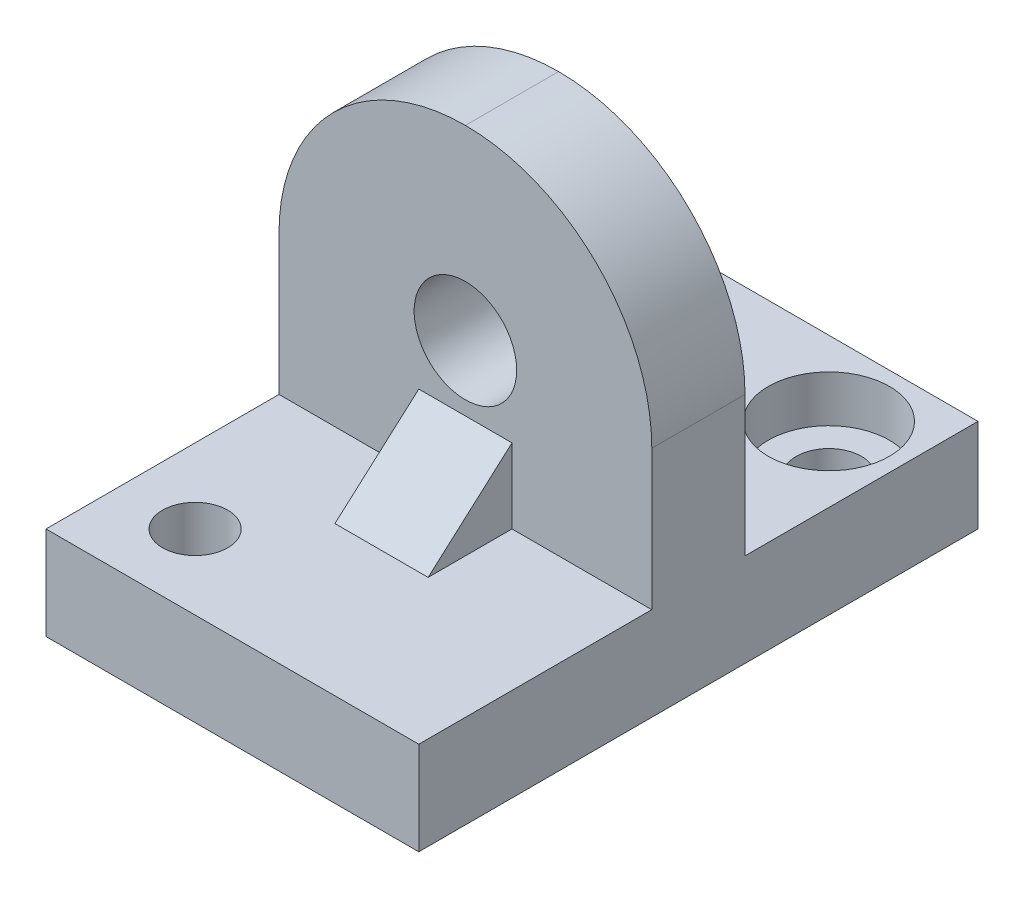
ISO-10303-21;
HEADER;
FILE_DESCRIPTION(('STEP AP214'),'2;1');
FILE_NAME('part.step','',(''),(''),'','','');
FILE_SCHEMA(('AUTOMOTIVE_DESIGN { 1 0 10303 214 1 1 1 1 }'));
ENDSEC;
DATA;
#1=APPLICATION_CONTEXT('core data for automotive mechanical design processes');
#2=APPLICATION_PROTOCOL_DEFINITION('international standard','automotive_design',2000,#1);
#3=PRODUCT_CONTEXT('',#1,'mechanical');
#4=PRODUCT('Part','Part','',(#3));
#5=PRODUCT_RELATED_PRODUCT_CATEGORY('part','',(#4));
#6=PRODUCT_DEFINITION_FORMATION('','',#4);
#7=PRODUCT_DEFINITION_CONTEXT('part definition',#1,'design');
#8=PRODUCT_DEFINITION('design','',#6,#7);
#9=PRODUCT_DEFINITION_SHAPE('','',#8);
#10=(LENGTH_UNIT() NAMED_UNIT(*) SI_UNIT(.MILLI.,.METRE.));
#11=(NAMED_UNIT(*) PLANE_ANGLE_UNIT() SI_UNIT($,.RADIAN.));
#12=(NAMED_UNIT(*) SI_UNIT($,.STERADIAN.) SOLID_ANGLE_UNIT());
#13=UNCERTAINTY_MEASURE_WITH_UNIT(LENGTH_MEASURE(1.E-05),#10,'distance_accuracy_value','');
#14=(GEOMETRIC_REPRESENTATION_CONTEXT(3) GLOBAL_UNCERTAINTY_ASSIGNED_CONTEXT((#13)) GLOBAL_UNIT_ASSIGNED_CONTEXT((#10,
#11,#12)) REPRESENTATION_CONTEXT('',''));
#15=CARTESIAN_POINT('',(0.,0.,0.));
#16=DIRECTION('',(0.,0.,1.));
#17=DIRECTION('',(1.,0.,0.));
#18=AXIS2_PLACEMENT_3D('',#15,#16,#17);
#19=CARTESIAN_POINT('',(12.,-27.5,-22.));
#20=DIRECTION('',(0.,1.,0.));
#21=DIRECTION('',(0.,0.,1.));
#22=AXIS2_PLACEMENT_3D('',#19,#20,#21);
#23=CYLINDRICAL_SURFACE('',#22,3.5);
#24=CARTESIAN_POINT('',(12.,-27.5,-22.));
#25=DIRECTION('',(0.,1.,0.));
#26=DIRECTION('',(0.,0.,1.));
#27=AXIS2_PLACEMENT_3D('',#24,#25,#26);
#28=CIRCLE('',#27,3.5);
#29=CARTESIAN_POINT('',(12.,-27.5,-18.5));
#30=VERTEX_POINT('',#29);
#31=EDGE_CURVE('E382',#30,#30,#28,.T.);
#32=ORIENTED_EDGE('',*,*,#31,.F.);
#33=EDGE_LOOP('',(#32));
#34=FACE_BOUND('',#33,.T.);
#35=CARTESIAN_POINT('',(12.,-22.5,-22.));
#36=DIRECTION('',(0.,1.,0.));
#37=DIRECTION('',(0.,0.,1.));
#38=AXIS2_PLACEMENT_3D('',#35,#36,#37);
#39=CIRCLE('',#38,3.5);
#40=CARTESIAN_POINT('',(12.,-22.5,-18.5));
#41=VERTEX_POINT('',#40);
#42=EDGE_CURVE('E50',#41,#41,#39,.F.);
#43=ORIENTED_EDGE('',*,*,#42,.F.);
#44=EDGE_LOOP('',(#43));
#45=FACE_BOUND('',#44,.T.);
#46=ADVANCED_FACE('F46',(#34,#45),#23,.F.);
#47=CARTESIAN_POINT('',(-20.,0.,5.));
#48=DIRECTION('',(0.,0.,-1.));
#49=DIRECTION('',(-1.,0.,0.));
#50=AXIS2_PLACEMENT_3D('',#47,#48,#49);
#51=PLANE('',#50);
#52=CARTESIAN_POINT('',(0.,-2.50000000000001,5.));
#53=DIRECTION('',(0.,0.,1.));
#54=DIRECTION('',(1.,0.,0.));
#55=AXIS2_PLACEMENT_3D('',#52,#53,#54);
#56=CIRCLE('',#55,5.5);
#57=CARTESIAN_POINT('',(5.5,-2.50000000000001,5.));
#58=VERTEX_POINT('',#57);
#59=EDGE_CURVE('E206',#58,#58,#56,.T.);
#60=ORIENTED_EDGE('',*,*,#59,.F.);
#61=EDGE_LOOP('',(#60));
#62=FACE_BOUND('',#61,.T.);
#63=DIRECTION('',(0.,1.,0.));
#64=VECTOR('',#63,1.);
#65=CARTESIAN_POINT('',(-5.,0.,5.));
#66=LINE('',#65,#64);
#67=CARTESIAN_POINT('',(-5.,-17.5,5.));
#68=VERTEX_POINT('',#67);
#69=CARTESIAN_POINT('',(-5.,-9.5,5.));
#70=VERTEX_POINT('',#69);
#71=EDGE_CURVE('E199',#68,#70,#66,.T.);
#72=ORIENTED_EDGE('',*,*,#71,.T.);
#73=DIRECTION('',(1.,0.,0.));
#74=VECTOR('',#73,1.);
#75=CARTESIAN_POINT('',(-5.,-9.5,5.));
#76=LINE('',#75,#74);
#77=CARTESIAN_POINT('',(5.,-9.5,5.));
#78=VERTEX_POINT('',#77);
#79=EDGE_CURVE('E203',#70,#78,#76,.T.);
#80=ORIENTED_EDGE('',*,*,#79,.T.);
#81=DIRECTION('',(0.,1.,0.));
#82=VECTOR('',#81,1.);
#83=CARTESIAN_POINT('',(5.,0.,5.));
#84=LINE('',#83,#82);
#85=CARTESIAN_POINT('',(5.,-17.5,5.));
#86=VERTEX_POINT('',#85);
#87=EDGE_CURVE('E192',#86,#78,#84,.T.);
#88=ORIENTED_EDGE('',*,*,#87,.F.);
#89=DIRECTION('',(1.,0.,0.));
#90=VECTOR('',#89,1.);
#91=CARTESIAN_POINT('',(-20.,-17.5,5.));
#92=LINE('',#91,#90);
#93=CARTESIAN_POINT('',(20.,-17.5,5.));
#94=VERTEX_POINT('',#93);
#95=EDGE_CURVE('E246',#86,#94,#92,.T.);
#96=ORIENTED_EDGE('',*,*,#95,.T.);
#97=DIRECTION('',(0.,1.,0.));
#98=VECTOR('',#97,1.);
#99=CARTESIAN_POINT('',(20.,0.,5.));
#100=LINE('',#99,#98);
#101=CARTESIAN_POINT('',(20.,-2.50000000000001,5.));
#102=VERTEX_POINT('',#101);
#103=EDGE_CURVE('E212',#94,#102,#100,.T.);
#104=ORIENTED_EDGE('',*,*,#103,.T.);
#105=CARTESIAN_POINT('',(0.,-2.50000000000001,5.));
#106=DIRECTION('',(0.,0.,-1.));
#107=DIRECTION('',(-1.,0.,0.));
#108=AXIS2_PLACEMENT_3D('',#105,#106,#107);
#109=CIRCLE('',#108,20.);
#110=CARTESIAN_POINT('',(0.,17.5,5.));
#111=VERTEX_POINT('',#110);
#112=EDGE_CURVE('E265',#102,#111,#109,.F.);
#113=ORIENTED_EDGE('',*,*,#112,.T.);
#114=CARTESIAN_POINT('',(0.,-2.50000000000001,5.));
#115=DIRECTION('',(0.,0.,-1.));
#116=DIRECTION('',(-1.,0.,0.));
#117=AXIS2_PLACEMENT_3D('',#114,#115,#116);
#118=CIRCLE('',#117,20.);
#119=CARTESIAN_POINT('',(-20.,-2.50000000000001,5.));
#120=VERTEX_POINT('',#119);
#121=EDGE_CURVE('E55',#111,#120,#118,.F.);
#122=ORIENTED_EDGE('',*,*,#121,.T.);
#123=DIRECTION('',(0.,1.,0.));
#124=VECTOR('',#123,1.);
#125=CARTESIAN_POINT('',(-20.,0.,5.));
#126=LINE('',#125,#124);
#127=CARTESIAN_POINT('',(-20.,-17.5,5.));
#128=VERTEX_POINT('',#127);
#129=EDGE_CURVE('E232',#128,#120,#126,.T.);
#130=ORIENTED_EDGE('',*,*,#129,.F.);
#131=EDGE_CURVE('E256',#128,#68,#92,.T.);
#132=ORIENTED_EDGE('',*,*,#131,.T.);
#133=EDGE_LOOP('',(#72,#80,#88,#96,#104,#113,#122,#130,#132));
#134=FACE_BOUND('',#133,.T.);
#135=ADVANCED_FACE('F284',(#62,#134),#51,.F.);
#136=CARTESIAN_POINT('',(-20.,-17.5,0.));
#137=DIRECTION('',(0.,-1.,0.));
#138=DIRECTION('',(0.,0.,-1.));
#139=AXIS2_PLACEMENT_3D('',#136,#137,#138);
#140=PLANE('',#139);
#141=CARTESIAN_POINT('',(-12.,-17.5,22.));
#142=DIRECTION('',(0.,1.,0.));
#143=DIRECTION('',(0.,0.,1.));
#144=AXIS2_PLACEMENT_3D('',#141,#142,#143);
#145=CIRCLE('',#144,3.5);
#146=CARTESIAN_POINT('',(-12.,-17.5,25.5));
#147=VERTEX_POINT('',#146);
#148=EDGE_CURVE('E378',#147,#147,#145,.T.);
#149=ORIENTED_EDGE('',*,*,#148,.F.);
#150=EDGE_LOOP('',(#149));
#151=FACE_BOUND('',#150,.T.);
#152=DIRECTION('',(0.,0.,-1.));
#153=VECTOR('',#152,1.);
#154=CARTESIAN_POINT('',(-5.,-17.5,0.));
#155=LINE('',#154,#153);
#156=CARTESIAN_POINT('',(-5.,-17.5,14.));
#157=VERTEX_POINT('',#156);
#158=EDGE_CURVE('E196',#157,#68,#155,.T.);
#159=ORIENTED_EDGE('',*,*,#158,.T.);
#160=ORIENTED_EDGE('',*,*,#131,.F.);
#161=DIRECTION('',(0.,0.,-1.));
#162=VECTOR('',#161,1.);
#163=CARTESIAN_POINT('',(-20.,-17.5,0.));
#164=LINE('',#163,#162);
#165=CARTESIAN_POINT('',(-20.,-17.5,30.));
#166=VERTEX_POINT('',#165);
#167=EDGE_CURVE('E235',#166,#128,#164,.T.);
#168=ORIENTED_EDGE('',*,*,#167,.F.);
#169=DIRECTION('',(1.,0.,0.));
#170=VECTOR('',#169,1.);
#171=CARTESIAN_POINT('',(-20.,-17.5,30.));
#172=LINE('',#171,#170);
#173=CARTESIAN_POINT('',(20.,-17.5,30.));
#174=VERTEX_POINT('',#173);
#175=EDGE_CURVE('E254',#166,#174,#172,.T.);
#176=ORIENTED_EDGE('',*,*,#175,.T.);
#177=DIRECTION('',(0.,0.,-1.));
#178=VECTOR('',#177,1.);
#179=CARTESIAN_POINT('',(20.,-17.5,0.));
#180=LINE('',#179,#178);
#181=EDGE_CURVE('E215',#174,#94,#180,.T.);
#182=ORIENTED_EDGE('',*,*,#181,.T.);
#183=ORIENTED_EDGE('',*,*,#95,.F.);
#184=DIRECTION('',(0.,0.,-1.));
#185=VECTOR('',#184,1.);
#186=CARTESIAN_POINT('',(5.,-17.5,0.));
#187=LINE('',#186,#185);
#188=CARTESIAN_POINT('',(5.,-17.5,14.));
#189=VERTEX_POINT('',#188);
#190=EDGE_CURVE('E190',#189,#86,#187,.T.);
#191=ORIENTED_EDGE('',*,*,#190,.F.);
#192=DIRECTION('',(1.,0.,0.));
#193=VECTOR('',#192,1.);
#194=CARTESIAN_POINT('',(-5.,-17.5,14.));
#195=LINE('',#194,#193);
#196=EDGE_CURVE('E202',#157,#189,#195,.T.);
#197=ORIENTED_EDGE('',*,*,#196,.F.);
#198=EDGE_LOOP('',(#159,#160,#168,#176,#182,#183,#191,#197));
#199=FACE_BOUND('',#198,.T.);
#200=ADVANCED_FACE('F275',(#151,#199),#140,.F.);
#201=CARTESIAN_POINT('',(-20.,0.,-5.));
#202=DIRECTION('',(0.,0.,-1.));
#203=DIRECTION('',(0.,1.,0.));
#204=AXIS2_PLACEMENT_3D('',#201,#202,#203);
#205=PLANE('',#204);
#206=DIRECTION('',(0.,1.,0.));
#207=VECTOR('',#206,1.);
#208=CARTESIAN_POINT('',(5.,0.,-5.));
#209=LINE('',#208,#207);
#210=CARTESIAN_POINT('',(5.,-17.5,-5.));
#211=VERTEX_POINT('',#210);
#212=CARTESIAN_POINT('',(5.,-9.50000000000001,-5.));
#213=VERTEX_POINT('',#212);
#214=EDGE_CURVE('E63',#211,#213,#209,.T.);
#215=ORIENTED_EDGE('',*,*,#214,.T.);
#216=DIRECTION('',(-1.,0.,0.));
#217=VECTOR('',#216,1.);
#218=CARTESIAN_POINT('',(5.,-9.50000000000001,-5.));
#219=LINE('',#218,#217);
#220=CARTESIAN_POINT('',(-5.,-9.50000000000001,-5.));
#221=VERTEX_POINT('',#220);
#222=EDGE_CURVE('E67',#213,#221,#219,.T.);
#223=ORIENTED_EDGE('',*,*,#222,.T.);
#224=DIRECTION('',(0.,1.,0.));
#225=VECTOR('',#224,1.);
#226=CARTESIAN_POINT('',(-5.,0.,-5.));
#227=LINE('',#226,#225);
#228=CARTESIAN_POINT('',(-5.,-17.5,-5.));
#229=VERTEX_POINT('',#228);
#230=EDGE_CURVE('E165',#229,#221,#227,.T.);
#231=ORIENTED_EDGE('',*,*,#230,.F.);
#232=DIRECTION('',(1.,0.,0.));
#233=VECTOR('',#232,1.);
#234=CARTESIAN_POINT('',(-20.,-17.5,-5.));
#235=LINE('',#234,#233);
#236=CARTESIAN_POINT('',(-20.,-17.5,-5.));
#237=VERTEX_POINT('',#236);
#238=EDGE_CURVE('E153',#237,#229,#235,.T.);
#239=ORIENTED_EDGE('',*,*,#238,.F.);
#240=DIRECTION('',(0.,1.,0.));
#241=VECTOR('',#240,1.);
#242=CARTESIAN_POINT('',(-20.,0.,-5.));
#243=LINE('',#242,#241);
#244=CARTESIAN_POINT('',(-20.,-2.50000000000001,-5.));
#245=VERTEX_POINT('',#244);
#246=EDGE_CURVE('E245',#237,#245,#243,.T.);
#247=ORIENTED_EDGE('',*,*,#246,.T.);
#248=CARTESIAN_POINT('',(0.,-2.50000000000001,-5.));
#249=DIRECTION('',(0.,0.,-1.));
#250=DIRECTION('',(0.,1.,0.));
#251=AXIS2_PLACEMENT_3D('',#248,#249,#250);
#252=CIRCLE('',#251,20.);
#253=CARTESIAN_POINT('',(0.,17.5,-5.));
#254=VERTEX_POINT('',#253);
#255=EDGE_CURVE('E263',#245,#254,#252,.T.);
#256=ORIENTED_EDGE('',*,*,#255,.T.);
#257=CARTESIAN_POINT('',(0.,-2.50000000000001,-5.));
#258=DIRECTION('',(0.,0.,-1.));
#259=DIRECTION('',(0.,1.,0.));
#260=AXIS2_PLACEMENT_3D('',#257,#258,#259);
#261=CIRCLE('',#260,20.);
#262=CARTESIAN_POINT('',(20.,-2.50000000000001,-5.));
#263=VERTEX_POINT('',#262);
#264=EDGE_CURVE('E261',#254,#263,#261,.T.);
#265=ORIENTED_EDGE('',*,*,#264,.T.);
#266=DIRECTION('',(0.,1.,0.));
#267=VECTOR('',#266,1.);
#268=CARTESIAN_POINT('',(20.,0.,-5.));
#269=LINE('',#268,#267);
#270=CARTESIAN_POINT('',(20.,-17.5,-5.));
#271=VERTEX_POINT('',#270);
#272=EDGE_CURVE('E229',#271,#263,#269,.T.);
#273=ORIENTED_EDGE('',*,*,#272,.F.);
#274=EDGE_CURVE('E163',#211,#271,#235,.T.);
#275=ORIENTED_EDGE('',*,*,#274,.F.);
#276=EDGE_LOOP('',(#215,#223,#231,#239,#247,#256,#265,#273,#275));
#277=FACE_BOUND('',#276,.T.);
#278=CARTESIAN_POINT('',(0.,-2.50000000000001,-5.));
#279=DIRECTION('',(0.,0.,-1.));
#280=DIRECTION('',(0.,1.,0.));
#281=AXIS2_PLACEMENT_3D('',#278,#279,#280);
#282=CIRCLE('',#281,5.5);
#283=CARTESIAN_POINT('',(0.,2.99999999999999,-5.));
#284=VERTEX_POINT('',#283);
#285=EDGE_CURVE('E211',#284,#284,#282,.T.);
#286=ORIENTED_EDGE('',*,*,#285,.F.);
#287=EDGE_LOOP('',(#286));
#288=FACE_BOUND('',#287,.T.);
#289=ADVANCED_FACE('F166',(#277,#288),#205,.T.);
#290=CARTESIAN_POINT('',(12.,-17.5,-22.));
#291=DIRECTION('',(0.,1.,0.));
#292=DIRECTION('',(0.,0.,1.));
#293=AXIS2_PLACEMENT_3D('',#290,#291,#292);
#294=CIRCLE('',#293,6.5);
#295=CARTESIAN_POINT('',(12.,-17.5,-15.5));
#296=VERTEX_POINT('',#295);
#297=EDGE_CURVE('E386',#296,#296,#294,.T.);
#298=ORIENTED_EDGE('',*,*,#297,.F.);
#299=EDGE_LOOP('',(#298));
#300=FACE_BOUND('',#299,.T.);
#301=DIRECTION('',(-1.,0.,0.));
#302=VECTOR('',#301,1.);
#303=CARTESIAN_POINT('',(5.,-17.5,-14.));
#304=LINE('',#303,#302);
#305=CARTESIAN_POINT('',(5.,-17.5,-14.));
#306=VERTEX_POINT('',#305);
#307=CARTESIAN_POINT('',(-5.,-17.5,-14.));
#308=VERTEX_POINT('',#307);
#309=EDGE_CURVE('E184',#306,#308,#304,.T.);
#310=ORIENTED_EDGE('',*,*,#309,.F.);
#311=DIRECTION('',(0.,0.,-1.));
#312=VECTOR('',#311,1.);
#313=CARTESIAN_POINT('',(5.,-17.5,0.));
#314=LINE('',#313,#312);
#315=EDGE_CURVE('E181',#211,#306,#314,.T.);
#316=ORIENTED_EDGE('',*,*,#315,.F.);
#317=ORIENTED_EDGE('',*,*,#274,.T.);
#318=CARTESIAN_POINT('',(20.,-17.5,-30.));
#319=VERTEX_POINT('',#318);
#320=EDGE_CURVE('E220',#271,#319,#180,.T.);
#321=ORIENTED_EDGE('',*,*,#320,.T.);
#322=DIRECTION('',(1.,0.,0.));
#323=VECTOR('',#322,1.);
#324=CARTESIAN_POINT('',(-20.,-17.5,-30.));
#325=LINE('',#324,#323);
#326=CARTESIAN_POINT('',(-20.,-17.5,-30.));
#327=VERTEX_POINT('',#326);
#328=EDGE_CURVE('E248',#327,#319,#325,.T.);
#329=ORIENTED_EDGE('',*,*,#328,.F.);
#330=EDGE_CURVE('E159',#237,#327,#164,.T.);
#331=ORIENTED_EDGE('',*,*,#330,.F.);
#332=ORIENTED_EDGE('',*,*,#238,.T.);
#333=DIRECTION('',(0.,0.,-1.));
#334=VECTOR('',#333,1.);
#335=CARTESIAN_POINT('',(-5.,-17.5,0.));
#336=LINE('',#335,#334);
#337=EDGE_CURVE('E156',#229,#308,#336,.T.);
#338=ORIENTED_EDGE('',*,*,#337,.T.);
#339=EDGE_LOOP('',(#310,#316,#317,#321,#329,#331,#332,#338));
#340=FACE_BOUND('',#339,.T.);
#341=ADVANCED_FACE('F154',(#300,#340),#140,.F.);
#342=CARTESIAN_POINT('',(-20.,0.,-30.));
#343=DIRECTION('',(0.,0.,-1.));
#344=DIRECTION('',(-1.,0.,0.));
#345=AXIS2_PLACEMENT_3D('',#342,#343,#344);
#346=PLANE('',#345);
#347=ORIENTED_EDGE('',*,*,#328,.T.);
#348=DIRECTION('',(0.,1.,0.));
#349=VECTOR('',#348,1.);
#350=CARTESIAN_POINT('',(20.,0.,-30.));
#351=LINE('',#350,#349);
#352=CARTESIAN_POINT('',(20.,-27.5,-30.));
#353=VERTEX_POINT('',#352);
#354=EDGE_CURVE('E226',#353,#319,#351,.T.);
#355=ORIENTED_EDGE('',*,*,#354,.F.);
#356=DIRECTION('',(1.,0.,0.));
#357=VECTOR('',#356,1.);
#358=CARTESIAN_POINT('',(-20.,-27.5,-30.));
#359=LINE('',#358,#357);
#360=CARTESIAN_POINT('',(-20.,-27.5,-30.));
#361=VERTEX_POINT('',#360);
#362=EDGE_CURVE('E250',#361,#353,#359,.T.);
#363=ORIENTED_EDGE('',*,*,#362,.F.);
#364=DIRECTION('',(0.,1.,0.));
#365=VECTOR('',#364,1.);
#366=CARTESIAN_POINT('',(-20.,0.,-30.));
#367=LINE('',#366,#365);
#368=EDGE_CURVE('E242',#361,#327,#367,.T.);
#369=ORIENTED_EDGE('',*,*,#368,.T.);
#370=EDGE_LOOP('',(#347,#355,#363,#369));
#371=FACE_BOUND('',#370,.T.);
#372=ADVANCED_FACE('F281',(#371),#346,.T.);
#373=CARTESIAN_POINT('',(-20.,-27.5,0.));
#374=DIRECTION('',(0.,-1.,0.));
#375=DIRECTION('',(0.,0.,-1.));
#376=AXIS2_PLACEMENT_3D('',#373,#374,#375);
#377=PLANE('',#376);
#378=ORIENTED_EDGE('',*,*,#31,.T.);
#379=EDGE_LOOP('',(#378));
#380=FACE_BOUND('',#379,.T.);
#381=CARTESIAN_POINT('',(-12.,-27.5,22.));
#382=DIRECTION('',(0.,1.,0.));
#383=DIRECTION('',(0.,0.,1.));
#384=AXIS2_PLACEMENT_3D('',#381,#382,#383);
#385=CIRCLE('',#384,3.5);
#386=CARTESIAN_POINT('',(-12.,-27.5,25.5));
#387=VERTEX_POINT('',#386);
#388=EDGE_CURVE('E376',#387,#387,#385,.T.);
#389=ORIENTED_EDGE('',*,*,#388,.T.);
#390=EDGE_LOOP('',(#389));
#391=FACE_BOUND('',#390,.T.);
#392=ORIENTED_EDGE('',*,*,#362,.T.);
#393=DIRECTION('',(0.,0.,-1.));
#394=VECTOR('',#393,1.);
#395=CARTESIAN_POINT('',(20.,-27.5,0.));
#396=LINE('',#395,#394);
#397=CARTESIAN_POINT('',(20.,-27.5,30.));
#398=VERTEX_POINT('',#397);
#399=EDGE_CURVE('E223',#398,#353,#396,.T.);
#400=ORIENTED_EDGE('',*,*,#399,.F.);
#401=DIRECTION('',(1.,0.,0.));
#402=VECTOR('',#401,1.);
#403=CARTESIAN_POINT('',(-20.,-27.5,30.));
#404=LINE('',#403,#402);
#405=CARTESIAN_POINT('',(-20.,-27.5,30.));
#406=VERTEX_POINT('',#405);
#407=EDGE_CURVE('E252',#406,#398,#404,.T.);
#408=ORIENTED_EDGE('',*,*,#407,.F.);
#409=DIRECTION('',(0.,0.,-1.));
#410=VECTOR('',#409,1.);
#411=CARTESIAN_POINT('',(-20.,-27.5,0.));
#412=LINE('',#411,#410);
#413=EDGE_CURVE('E239',#406,#361,#412,.T.);
#414=ORIENTED_EDGE('',*,*,#413,.T.);
#415=EDGE_LOOP('',(#392,#400,#408,#414));
#416=FACE_BOUND('',#415,.T.);
#417=ADVANCED_FACE('F341',(#380,#391,#416),#377,.T.);
#418=CARTESIAN_POINT('',(-20.,0.,30.));
#419=DIRECTION('',(0.,0.,-1.));
#420=DIRECTION('',(-1.,0.,0.));
#421=AXIS2_PLACEMENT_3D('',#418,#419,#420);
#422=PLANE('',#421);
#423=ORIENTED_EDGE('',*,*,#407,.T.);
#424=DIRECTION('',(0.,1.,0.));
#425=VECTOR('',#424,1.);
#426=CARTESIAN_POINT('',(20.,0.,30.));
#427=LINE('',#426,#425);
#428=EDGE_CURVE('E219',#398,#174,#427,.T.);
#429=ORIENTED_EDGE('',*,*,#428,.T.);
#430=ORIENTED_EDGE('',*,*,#175,.F.);
#431=DIRECTION('',(0.,1.,0.));
#432=VECTOR('',#431,1.);
#433=CARTESIAN_POINT('',(-20.,0.,30.));
#434=LINE('',#433,#432);
#435=EDGE_CURVE('E237',#406,#166,#434,.T.);
#436=ORIENTED_EDGE('',*,*,#435,.F.);
#437=EDGE_LOOP('',(#423,#429,#430,#436));
#438=FACE_BOUND('',#437,.T.);
#439=ADVANCED_FACE('F336',(#438),#422,.F.);
#440=CARTESIAN_POINT('',(-20.,0.,0.));
#441=DIRECTION('',(1.,0.,0.));
#442=DIRECTION('',(0.,0.,-1.));
#443=AXIS2_PLACEMENT_3D('',#440,#441,#442);
#444=PLANE('',#443);
#445=ORIENTED_EDGE('',*,*,#129,.T.);
#446=DIRECTION('',(0.,0.,-1.));
#447=VECTOR('',#446,1.);
#448=CARTESIAN_POINT('',(-20.,-2.50000000000001,0.));
#449=LINE('',#448,#447);
#450=EDGE_CURVE('E162',#120,#245,#449,.T.);
#451=ORIENTED_EDGE('',*,*,#450,.T.);
#452=ORIENTED_EDGE('',*,*,#246,.F.);
#453=ORIENTED_EDGE('',*,*,#330,.T.);
#454=ORIENTED_EDGE('',*,*,#368,.F.);
#455=ORIENTED_EDGE('',*,*,#413,.F.);
#456=ORIENTED_EDGE('',*,*,#435,.T.);
#457=ORIENTED_EDGE('',*,*,#167,.T.);
#458=EDGE_LOOP('',(#445,#451,#452,#453,#454,#455,#456,#457));
#459=FACE_BOUND('',#458,.T.);
#460=ADVANCED_FACE('F333',(#459),#444,.F.);
#461=CARTESIAN_POINT('',(20.,0.,0.));
#462=DIRECTION('',(1.,0.,0.));
#463=DIRECTION('',(0.,0.,-1.));
#464=AXIS2_PLACEMENT_3D('',#461,#462,#463);
#465=PLANE('',#464);
#466=ORIENTED_EDGE('',*,*,#272,.T.);
#467=DIRECTION('',(0.,0.,-1.));
#468=VECTOR('',#467,1.);
#469=CARTESIAN_POINT('',(20.,-2.50000000000001,5.));
#470=LINE('',#469,#468);
#471=EDGE_CURVE('E13',#263,#102,#470,.F.);
#472=ORIENTED_EDGE('',*,*,#471,.T.);
#473=ORIENTED_EDGE('',*,*,#103,.F.);
#474=ORIENTED_EDGE('',*,*,#181,.F.);
#475=ORIENTED_EDGE('',*,*,#428,.F.);
#476=ORIENTED_EDGE('',*,*,#399,.T.);
#477=ORIENTED_EDGE('',*,*,#354,.T.);
#478=ORIENTED_EDGE('',*,*,#320,.F.);
#479=EDGE_LOOP('',(#466,#472,#473,#474,#475,#476,#477,#478));
#480=FACE_BOUND('',#479,.T.);
#481=ADVANCED_FACE('F331',(#480),#465,.T.);
#482=CARTESIAN_POINT('',(0.,-2.50000000000001,0.));
#483=DIRECTION('',(0.,0.,1.));
#484=DIRECTION('',(1.,0.,0.));
#485=AXIS2_PLACEMENT_3D('',#482,#483,#484);
#486=CYLINDRICAL_SURFACE('',#485,20.);
#487=DIRECTION('',(0.,0.,-1.));
#488=VECTOR('',#487,1.);
#489=CARTESIAN_POINT('',(0.,17.5,-5.));
#490=LINE('',#489,#488);
#491=EDGE_CURVE('E216',#111,#254,#490,.T.);
#492=ORIENTED_EDGE('',*,*,#491,.F.);
#493=ORIENTED_EDGE('',*,*,#112,.F.);
#494=ORIENTED_EDGE('',*,*,#471,.F.);
#495=ORIENTED_EDGE('',*,*,#264,.F.);
#496=EDGE_LOOP('',(#492,#493,#494,#495));
#497=FACE_BOUND('',#496,.T.);
#498=ADVANCED_FACE('F48',(#497),#486,.T.);
#499=CARTESIAN_POINT('',(0.,-2.50000000000001,0.));
#500=DIRECTION('',(0.,0.,-1.));
#501=DIRECTION('',(-1.,0.,0.));
#502=AXIS2_PLACEMENT_3D('',#499,#500,#501);
#503=CYLINDRICAL_SURFACE('',#502,20.);
#504=ORIENTED_EDGE('',*,*,#121,.F.);
#505=ORIENTED_EDGE('',*,*,#491,.T.);
#506=ORIENTED_EDGE('',*,*,#255,.F.);
#507=ORIENTED_EDGE('',*,*,#450,.F.);
#508=EDGE_LOOP('',(#504,#505,#506,#507));
#509=FACE_BOUND('',#508,.T.);
#510=ADVANCED_FACE('F330',(#509),#503,.T.);
#511=CARTESIAN_POINT('',(0.,-2.50000000000001,-30.));
#512=DIRECTION('',(0.,0.,1.));
#513=DIRECTION('',(1.,0.,0.));
#514=AXIS2_PLACEMENT_3D('',#511,#512,#513);
#515=CYLINDRICAL_SURFACE('',#514,5.5);
#516=ORIENTED_EDGE('',*,*,#285,.T.);
#517=EDGE_LOOP('',(#516));
#518=FACE_BOUND('',#517,.T.);
#519=ORIENTED_EDGE('',*,*,#59,.T.);
#520=EDGE_LOOP('',(#519));
#521=FACE_BOUND('',#520,.T.);
#522=ADVANCED_FACE('F272',(#518,#521),#515,.F.);
#523=CARTESIAN_POINT('',(-5.,-2.82413793103448,-2.51034482758621));
#524=DIRECTION('',(0.,-0.74740931868366,-0.66436383882992));
#525=DIRECTION('',(0.,0.66436383882992,-0.74740931868366));
#526=AXIS2_PLACEMENT_3D('',#523,#524,#525);
#527=PLANE('',#526);
#528=DIRECTION('',(0.,0.66436383882992,-0.74740931868366));
#529=VECTOR('',#528,1.);
#530=CARTESIAN_POINT('',(5.,-2.82413793103448,-2.51034482758621));
#531=LINE('',#530,#529);
#532=EDGE_CURVE('E187',#189,#78,#531,.T.);
#533=ORIENTED_EDGE('',*,*,#532,.T.);
#534=ORIENTED_EDGE('',*,*,#79,.F.);
#535=DIRECTION('',(0.,0.66436383882992,-0.74740931868366));
#536=VECTOR('',#535,1.);
#537=CARTESIAN_POINT('',(-5.,-2.82413793103448,-2.51034482758621));
#538=LINE('',#537,#536);
#539=EDGE_CURVE('E194',#157,#70,#538,.T.);
#540=ORIENTED_EDGE('',*,*,#539,.F.);
#541=ORIENTED_EDGE('',*,*,#196,.T.);
#542=EDGE_LOOP('',(#533,#534,#540,#541));
#543=FACE_BOUND('',#542,.T.);
#544=ADVANCED_FACE('F323',(#543),#527,.F.);
#545=CARTESIAN_POINT('',(-5.,0.,0.));
#546=DIRECTION('',(1.,0.,0.));
#547=DIRECTION('',(0.,0.,-1.));
#548=AXIS2_PLACEMENT_3D('',#545,#546,#547);
#549=PLANE('',#548);
#550=ORIENTED_EDGE('',*,*,#539,.T.);
#551=ORIENTED_EDGE('',*,*,#71,.F.);
#552=ORIENTED_EDGE('',*,*,#158,.F.);
#553=EDGE_LOOP('',(#550,#551,#552));
#554=FACE_BOUND('',#553,.T.);
#555=ADVANCED_FACE('F319',(#554),#549,.F.);
#556=CARTESIAN_POINT('',(5.,0.,0.));
#557=DIRECTION('',(1.,0.,0.));
#558=DIRECTION('',(0.,0.,-1.));
#559=AXIS2_PLACEMENT_3D('',#556,#557,#558);
#560=PLANE('',#559);
#561=ORIENTED_EDGE('',*,*,#532,.F.);
#562=ORIENTED_EDGE('',*,*,#190,.T.);
#563=ORIENTED_EDGE('',*,*,#87,.T.);
#564=EDGE_LOOP('',(#561,#562,#563));
#565=FACE_BOUND('',#564,.T.);
#566=ADVANCED_FACE('F315',(#565),#560,.T.);
#567=CARTESIAN_POINT('',(5.,-2.82413793103449,2.51034482758621));
#568=DIRECTION('',(0.,0.74740931868366,-0.66436383882992));
#569=DIRECTION('',(0.,0.66436383882992,0.74740931868366));
#570=AXIS2_PLACEMENT_3D('',#567,#568,#569);
#571=PLANE('',#570);
#572=ORIENTED_EDGE('',*,*,#309,.T.);
#573=DIRECTION('',(0.,-0.66436383882992,-0.74740931868366));
#574=VECTOR('',#573,1.);
#575=CARTESIAN_POINT('',(-5.,-2.82413793103449,2.51034482758621));
#576=LINE('',#575,#574);
#577=EDGE_CURVE('E171',#221,#308,#576,.T.);
#578=ORIENTED_EDGE('',*,*,#577,.F.);
#579=ORIENTED_EDGE('',*,*,#222,.F.);
#580=DIRECTION('',(0.,-0.66436383882992,-0.74740931868366));
#581=VECTOR('',#580,1.);
#582=CARTESIAN_POINT('',(5.,-2.82413793103449,2.51034482758621));
#583=LINE('',#582,#581);
#584=EDGE_CURVE('E174',#213,#306,#583,.T.);
#585=ORIENTED_EDGE('',*,*,#584,.T.);
#586=EDGE_LOOP('',(#572,#578,#579,#585));
#587=FACE_BOUND('',#586,.T.);
#588=ADVANCED_FACE('F311',(#587),#571,.T.);
#589=CARTESIAN_POINT('',(5.,0.,0.));
#590=DIRECTION('',(1.,0.,0.));
#591=DIRECTION('',(0.,0.,-1.));
#592=AXIS2_PLACEMENT_3D('',#589,#590,#591);
#593=PLANE('',#592);
#594=ORIENTED_EDGE('',*,*,#584,.F.);
#595=ORIENTED_EDGE('',*,*,#214,.F.);
#596=ORIENTED_EDGE('',*,*,#315,.T.);
#597=EDGE_LOOP('',(#594,#595,#596));
#598=FACE_BOUND('',#597,.T.);
#599=ADVANCED_FACE('F308',(#598),#593,.T.);
#600=CARTESIAN_POINT('',(-5.,0.,0.));
#601=DIRECTION('',(1.,0.,0.));
#602=DIRECTION('',(0.,0.,-1.));
#603=AXIS2_PLACEMENT_3D('',#600,#601,#602);
#604=PLANE('',#603);
#605=ORIENTED_EDGE('',*,*,#577,.T.);
#606=ORIENTED_EDGE('',*,*,#337,.F.);
#607=ORIENTED_EDGE('',*,*,#230,.T.);
#608=EDGE_LOOP('',(#605,#606,#607));
#609=FACE_BOUND('',#608,.T.);
#610=ADVANCED_FACE('F173',(#609),#604,.F.);
#611=CARTESIAN_POINT('',(-12.,-27.5,22.));
#612=DIRECTION('',(0.,1.,0.));
#613=DIRECTION('',(0.,0.,1.));
#614=AXIS2_PLACEMENT_3D('',#611,#612,#613);
#615=CYLINDRICAL_SURFACE('',#614,3.5);
#616=ORIENTED_EDGE('',*,*,#388,.F.);
#617=EDGE_LOOP('',(#616));
#618=FACE_BOUND('',#617,.T.);
#619=ORIENTED_EDGE('',*,*,#148,.T.);
#620=EDGE_LOOP('',(#619));
#621=FACE_BOUND('',#620,.T.);
#622=ADVANCED_FACE('F301',(#618,#621),#615,.F.);
#623=CARTESIAN_POINT('',(12.,-22.5,-22.));
#624=DIRECTION('',(0.,1.,0.));
#625=DIRECTION('',(0.,0.,1.));
#626=AXIS2_PLACEMENT_3D('',#623,#624,#625);
#627=PLANE('',#626);
#628=CARTESIAN_POINT('',(12.,-22.5,-22.));
#629=DIRECTION('',(0.,1.,0.));
#630=DIRECTION('',(0.,0.,1.));
#631=AXIS2_PLACEMENT_3D('',#628,#629,#630);
#632=CIRCLE('',#631,6.5);
#633=CARTESIAN_POINT('',(12.,-22.5,-15.5));
#634=VERTEX_POINT('',#633);
#635=EDGE_CURVE('E389',#634,#634,#632,.T.);
#636=ORIENTED_EDGE('',*,*,#635,.T.);
#637=EDGE_LOOP('',(#636));
#638=FACE_BOUND('',#637,.T.);
#639=ORIENTED_EDGE('',*,*,#42,.T.);
#640=EDGE_LOOP('',(#639));
#641=FACE_BOUND('',#640,.T.);
#642=ADVANCED_FACE('F304',(#638,#641),#627,.T.);
#643=CARTESIAN_POINT('',(12.,-22.5,-22.));
#644=DIRECTION('',(0.,1.,0.));
#645=DIRECTION('',(0.,0.,1.));
#646=AXIS2_PLACEMENT_3D('',#643,#644,#645);
#647=CYLINDRICAL_SURFACE('',#646,6.5);
#648=ORIENTED_EDGE('',*,*,#635,.F.);
#649=EDGE_LOOP('',(#648));
#650=FACE_BOUND('',#649,.T.);
#651=ORIENTED_EDGE('',*,*,#297,.T.);
#652=EDGE_LOOP('',(#651));
#653=FACE_BOUND('',#652,.T.);
#654=ADVANCED_FACE('F299',(#650,#653),#647,.F.);
#655=CLOSED_SHELL('',(#46,#135,#200,#289,#341,#372,#417,#439,#460,#481,#498,#510,#522,#544,#555,
#566,#588,#599,#610,#622,#642,#654));
#656=MANIFOLD_SOLID_BREP('B2',#655);
#657=ADVANCED_BREP_SHAPE_REPRESENTATION('',(#18,#656),#14);
#658=SHAPE_DEFINITION_REPRESENTATION(#9,#657);
ENDSEC;
END-ISO-10303-21;
